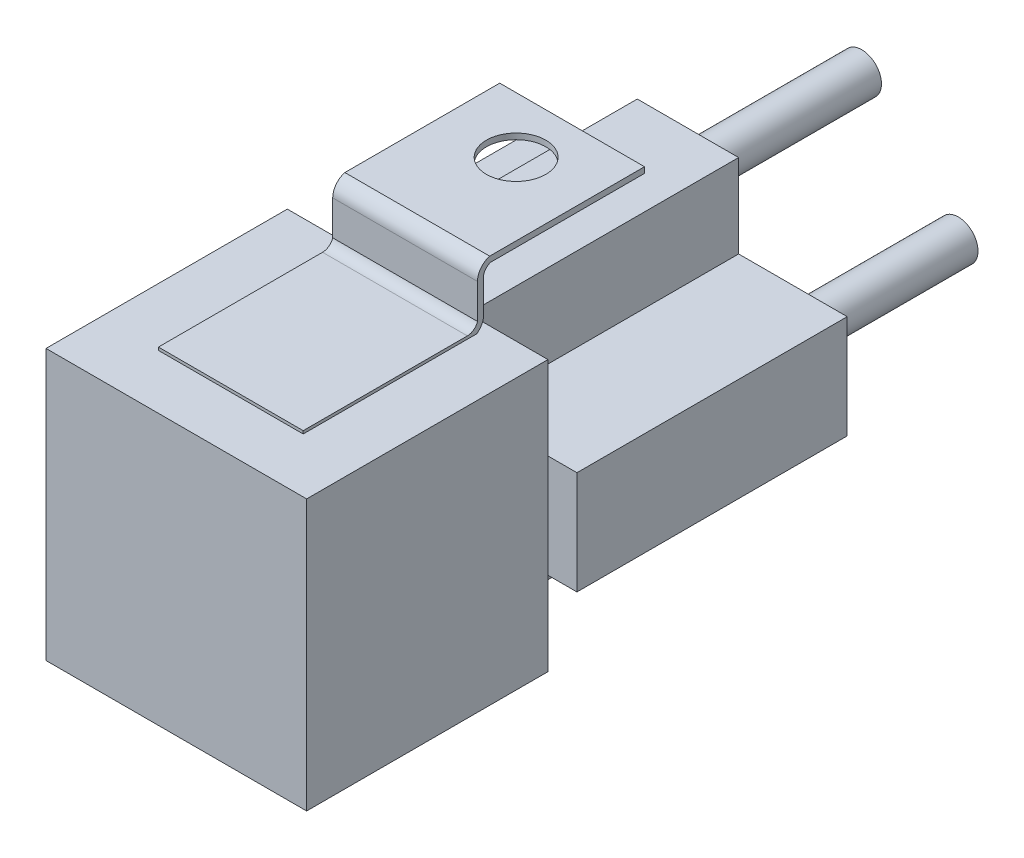
ISO-10303-21;
HEADER;
FILE_DESCRIPTION(('STEP AP214'),'2;1');
FILE_NAME('part.step','',(''),(''),'','','');
FILE_SCHEMA(('AUTOMOTIVE_DESIGN { 1 0 10303 214 1 1 1 1 }'));
ENDSEC;
DATA;
#1=APPLICATION_CONTEXT('core data for automotive mechanical design processes');
#2=APPLICATION_PROTOCOL_DEFINITION('international standard','automotive_design',2000,#1);
#3=PRODUCT_CONTEXT('',#1,'mechanical');
#4=PRODUCT('Part','Part','',(#3));
#5=PRODUCT_RELATED_PRODUCT_CATEGORY('part','',(#4));
#6=PRODUCT_DEFINITION_FORMATION('','',#4);
#7=PRODUCT_DEFINITION_CONTEXT('part definition',#1,'design');
#8=PRODUCT_DEFINITION('design','',#6,#7);
#9=PRODUCT_DEFINITION_SHAPE('','',#8);
#10=(LENGTH_UNIT() NAMED_UNIT(*) SI_UNIT(.MILLI.,.METRE.));
#11=(NAMED_UNIT(*) PLANE_ANGLE_UNIT() SI_UNIT($,.RADIAN.));
#12=(NAMED_UNIT(*) SI_UNIT($,.STERADIAN.) SOLID_ANGLE_UNIT());
#13=UNCERTAINTY_MEASURE_WITH_UNIT(LENGTH_MEASURE(1.E-05),#10,'distance_accuracy_value','');
#14=(GEOMETRIC_REPRESENTATION_CONTEXT(3) GLOBAL_UNCERTAINTY_ASSIGNED_CONTEXT((#13)) GLOBAL_UNIT_ASSIGNED_CONTEXT((#10,
#11,#12)) REPRESENTATION_CONTEXT('',''));
#15=CARTESIAN_POINT('',(0.,0.,0.));
#16=DIRECTION('',(0.,0.,1.));
#17=DIRECTION('',(1.,0.,0.));
#18=AXIS2_PLACEMENT_3D('',#15,#16,#17);
#19=CARTESIAN_POINT('',(0.,0.,-28.));
#20=DIRECTION('',(0.,0.,-1.));
#21=DIRECTION('',(-1.,0.,0.));
#22=AXIS2_PLACEMENT_3D('',#19,#20,#21);
#23=PLANE('',#22);
#24=CARTESIAN_POINT('',(-10.,0.,-28.));
#25=DIRECTION('',(0.,0.,-1.));
#26=DIRECTION('',(-1.,0.,0.));
#27=AXIS2_PLACEMENT_3D('',#24,#25,#26);
#28=CIRCLE('',#27,2.05);
#29=CARTESIAN_POINT('',(-12.05,0.,-28.));
#30=VERTEX_POINT('',#29);
#31=EDGE_CURVE('E362',#30,#30,#28,.T.);
#32=ORIENTED_EDGE('',*,*,#31,.F.);
#33=EDGE_LOOP('',(#32));
#34=FACE_BOUND('',#33,.T.);
#35=CARTESIAN_POINT('',(0.,10.,-28.));
#36=DIRECTION('',(0.,0.,-1.));
#37=DIRECTION('',(-1.,0.,0.));
#38=AXIS2_PLACEMENT_3D('',#35,#36,#37);
#39=CIRCLE('',#38,2.05);
#40=CARTESIAN_POINT('',(-2.05,10.,-28.));
#41=VERTEX_POINT('',#40);
#42=EDGE_CURVE('E373',#41,#41,#39,.T.);
#43=ORIENTED_EDGE('',*,*,#42,.F.);
#44=EDGE_LOOP('',(#43));
#45=FACE_BOUND('',#44,.T.);
#46=CARTESIAN_POINT('',(0.,-10.,-28.));
#47=DIRECTION('',(0.,0.,-1.));
#48=DIRECTION('',(-1.,0.,0.));
#49=AXIS2_PLACEMENT_3D('',#46,#47,#48);
#50=CIRCLE('',#49,2.05);
#51=CARTESIAN_POINT('',(-2.05,-10.,-28.));
#52=VERTEX_POINT('',#51);
#53=EDGE_CURVE('E377',#52,#52,#50,.T.);
#54=ORIENTED_EDGE('',*,*,#53,.F.);
#55=EDGE_LOOP('',(#54));
#56=FACE_BOUND('',#55,.T.);
#57=DIRECTION('',(1.,0.,0.));
#58=VECTOR('',#57,1.);
#59=CARTESIAN_POINT('',(-16.5,-5.35,-28.));
#60=LINE('',#59,#58);
#61=CARTESIAN_POINT('',(5.25,-5.35,-28.));
#62=VERTEX_POINT('',#61);
#63=CARTESIAN_POINT('',(16.5,-5.35,-28.));
#64=VERTEX_POINT('',#63);
#65=EDGE_CURVE('E393',#62,#64,#60,.T.);
#66=ORIENTED_EDGE('',*,*,#65,.F.);
#67=DIRECTION('',(0.,1.,0.));
#68=VECTOR('',#67,1.);
#69=CARTESIAN_POINT('',(5.25,-14.,-28.));
#70=LINE('',#69,#68);
#71=CARTESIAN_POINT('',(5.25,-14.,-28.));
#72=VERTEX_POINT('',#71);
#73=EDGE_CURVE('E435',#72,#62,#70,.T.);
#74=ORIENTED_EDGE('',*,*,#73,.F.);
#75=DIRECTION('',(1.,0.,0.));
#76=VECTOR('',#75,1.);
#77=CARTESIAN_POINT('',(-5.25,-14.,-28.));
#78=LINE('',#77,#76);
#79=CARTESIAN_POINT('',(-5.25,-14.,-28.));
#80=VERTEX_POINT('',#79);
#81=EDGE_CURVE('E430',#80,#72,#78,.T.);
#82=ORIENTED_EDGE('',*,*,#81,.F.);
#83=DIRECTION('',(0.,1.,0.));
#84=VECTOR('',#83,1.);
#85=CARTESIAN_POINT('',(-5.25,-14.,-28.));
#86=LINE('',#85,#84);
#87=CARTESIAN_POINT('',(-5.25,-5.35,-28.));
#88=VERTEX_POINT('',#87);
#89=EDGE_CURVE('E438',#80,#88,#86,.T.);
#90=ORIENTED_EDGE('',*,*,#89,.T.);
#91=CARTESIAN_POINT('',(-16.5,-5.35,-28.));
#92=VERTEX_POINT('',#91);
#93=EDGE_CURVE('E399',#92,#88,#60,.T.);
#94=ORIENTED_EDGE('',*,*,#93,.F.);
#95=DIRECTION('',(0.,1.,0.));
#96=VECTOR('',#95,1.);
#97=CARTESIAN_POINT('',(-16.5,-5.35,-28.));
#98=LINE('',#97,#96);
#99=CARTESIAN_POINT('',(-16.5,5.35,-28.));
#100=VERTEX_POINT('',#99);
#101=EDGE_CURVE('E383',#92,#100,#98,.T.);
#102=ORIENTED_EDGE('',*,*,#101,.T.);
#103=DIRECTION('',(1.,0.,0.));
#104=VECTOR('',#103,1.);
#105=CARTESIAN_POINT('',(-16.5,5.35,-28.));
#106=LINE('',#105,#104);
#107=CARTESIAN_POINT('',(-5.25,5.35,-28.));
#108=VERTEX_POINT('',#107);
#109=EDGE_CURVE('E386',#100,#108,#106,.T.);
#110=ORIENTED_EDGE('',*,*,#109,.T.);
#111=CARTESIAN_POINT('',(-5.25,14.,-28.));
#112=VERTEX_POINT('',#111);
#113=EDGE_CURVE('E437',#108,#112,#86,.T.);
#114=ORIENTED_EDGE('',*,*,#113,.T.);
#115=DIRECTION('',(1.,0.,0.));
#116=VECTOR('',#115,1.);
#117=CARTESIAN_POINT('',(-5.25,14.,-28.));
#118=LINE('',#117,#116);
#119=CARTESIAN_POINT('',(5.25,14.,-28.));
#120=VERTEX_POINT('',#119);
#121=EDGE_CURVE('E434',#112,#120,#118,.T.);
#122=ORIENTED_EDGE('',*,*,#121,.T.);
#123=CARTESIAN_POINT('',(5.25,5.35,-28.));
#124=VERTEX_POINT('',#123);
#125=EDGE_CURVE('E429',#124,#120,#70,.T.);
#126=ORIENTED_EDGE('',*,*,#125,.F.);
#127=CARTESIAN_POINT('',(16.5,5.35,-28.));
#128=VERTEX_POINT('',#127);
#129=EDGE_CURVE('E390',#124,#128,#106,.T.);
#130=ORIENTED_EDGE('',*,*,#129,.T.);
#131=DIRECTION('',(0.,1.,0.));
#132=VECTOR('',#131,1.);
#133=CARTESIAN_POINT('',(16.5,-5.35,-28.));
#134=LINE('',#133,#132);
#135=EDGE_CURVE('E394',#64,#128,#134,.T.);
#136=ORIENTED_EDGE('',*,*,#135,.F.);
#137=EDGE_LOOP('',(#66,#74,#82,#90,#94,#102,#110,#114,#122,#126,#130,#136));
#138=FACE_BOUND('',#137,.T.);
#139=CARTESIAN_POINT('',(10.,0.,-28.));
#140=DIRECTION('',(0.,0.,-1.));
#141=DIRECTION('',(-1.,0.,0.));
#142=AXIS2_PLACEMENT_3D('',#139,#140,#141);
#143=CIRCLE('',#142,2.05);
#144=CARTESIAN_POINT('',(7.95,0.,-28.));
#145=VERTEX_POINT('',#144);
#146=EDGE_CURVE('E361',#145,#145,#143,.T.);
#147=ORIENTED_EDGE('',*,*,#146,.F.);
#148=EDGE_LOOP('',(#147));
#149=FACE_BOUND('',#148,.T.);
#150=ADVANCED_FACE('F68',(#34,#45,#56,#138,#149),#23,.T.);
#151=CARTESIAN_POINT('',(0.,0.,0.));
#152=DIRECTION('',(0.,0.,1.));
#153=DIRECTION('',(1.,0.,0.));
#154=AXIS2_PLACEMENT_3D('',#151,#152,#153);
#155=PLANE('',#154);
#156=DIRECTION('',(1.,0.,0.));
#157=VECTOR('',#156,1.);
#158=CARTESIAN_POINT('',(-16.5,5.35,0.));
#159=LINE('',#158,#157);
#160=CARTESIAN_POINT('',(5.25,5.35,0.));
#161=VERTEX_POINT('',#160);
#162=CARTESIAN_POINT('',(13.5,5.35,0.));
#163=VERTEX_POINT('',#162);
#164=EDGE_CURVE('E406',#161,#163,#159,.T.);
#165=ORIENTED_EDGE('',*,*,#164,.F.);
#166=DIRECTION('',(0.,1.,0.));
#167=VECTOR('',#166,1.);
#168=CARTESIAN_POINT('',(5.25,-14.,0.));
#169=LINE('',#168,#167);
#170=CARTESIAN_POINT('',(5.25,14.,0.));
#171=VERTEX_POINT('',#170);
#172=EDGE_CURVE('E363',#161,#171,#169,.T.);
#173=ORIENTED_EDGE('',*,*,#172,.T.);
#174=DIRECTION('',(-1.,0.,0.));
#175=VECTOR('',#174,1.);
#176=CARTESIAN_POINT('',(-13.5,14.,0.));
#177=LINE('',#176,#175);
#178=CARTESIAN_POINT('',(13.5,14.,0.));
#179=VERTEX_POINT('',#178);
#180=EDGE_CURVE('E481',#179,#171,#177,.T.);
#181=ORIENTED_EDGE('',*,*,#180,.F.);
#182=DIRECTION('',(0.,1.,0.));
#183=VECTOR('',#182,1.);
#184=CARTESIAN_POINT('',(13.5,14.,0.));
#185=LINE('',#184,#183);
#186=EDGE_CURVE('E461',#163,#179,#185,.T.);
#187=ORIENTED_EDGE('',*,*,#186,.F.);
#188=EDGE_LOOP('',(#165,#173,#181,#187));
#189=FACE_BOUND('',#188,.T.);
#190=ADVANCED_FACE('F556',(#189),#155,.F.);
#191=DIRECTION('',(0.,1.,0.));
#192=VECTOR('',#191,1.);
#193=CARTESIAN_POINT('',(-5.25,-14.,0.));
#194=LINE('',#193,#192);
#195=CARTESIAN_POINT('',(-5.25,5.35,0.));
#196=VERTEX_POINT('',#195);
#197=CARTESIAN_POINT('',(-5.25,14.,0.));
#198=VERTEX_POINT('',#197);
#199=EDGE_CURVE('E447',#196,#198,#194,.T.);
#200=ORIENTED_EDGE('',*,*,#199,.F.);
#201=CARTESIAN_POINT('',(-13.5,5.35,0.));
#202=VERTEX_POINT('',#201);
#203=EDGE_CURVE('E370',#202,#196,#159,.T.);
#204=ORIENTED_EDGE('',*,*,#203,.F.);
#205=DIRECTION('',(0.,-1.,0.));
#206=VECTOR('',#205,1.);
#207=CARTESIAN_POINT('',(-13.5,14.,0.));
#208=LINE('',#207,#206);
#209=CARTESIAN_POINT('',(-13.5,14.,0.));
#210=VERTEX_POINT('',#209);
#211=EDGE_CURVE('E484',#210,#202,#208,.T.);
#212=ORIENTED_EDGE('',*,*,#211,.F.);
#213=EDGE_CURVE('E479',#198,#210,#177,.T.);
#214=ORIENTED_EDGE('',*,*,#213,.F.);
#215=EDGE_LOOP('',(#200,#204,#212,#214));
#216=FACE_BOUND('',#215,.T.);
#217=ADVANCED_FACE('F570',(#216),#155,.F.);
#218=CARTESIAN_POINT('',(-13.5,-5.35,0.));
#219=VERTEX_POINT('',#218);
#220=CARTESIAN_POINT('',(-13.5,-14.,0.));
#221=VERTEX_POINT('',#220);
#222=EDGE_CURVE('E482',#219,#221,#208,.T.);
#223=ORIENTED_EDGE('',*,*,#222,.F.);
#224=DIRECTION('',(1.,0.,0.));
#225=VECTOR('',#224,1.);
#226=CARTESIAN_POINT('',(-16.5,-5.35,0.));
#227=LINE('',#226,#225);
#228=CARTESIAN_POINT('',(-5.25,-5.35,0.));
#229=VERTEX_POINT('',#228);
#230=EDGE_CURVE('E505',#219,#229,#227,.T.);
#231=ORIENTED_EDGE('',*,*,#230,.T.);
#232=CARTESIAN_POINT('',(-5.25,-14.,0.));
#233=VERTEX_POINT('',#232);
#234=EDGE_CURVE('E431',#233,#229,#194,.T.);
#235=ORIENTED_EDGE('',*,*,#234,.F.);
#236=DIRECTION('',(1.,0.,0.));
#237=VECTOR('',#236,1.);
#238=CARTESIAN_POINT('',(-13.5,-14.,0.));
#239=LINE('',#238,#237);
#240=EDGE_CURVE('E468',#221,#233,#239,.T.);
#241=ORIENTED_EDGE('',*,*,#240,.F.);
#242=EDGE_LOOP('',(#223,#231,#235,#241));
#243=FACE_BOUND('',#242,.T.);
#244=ADVANCED_FACE('F616',(#243),#155,.F.);
#245=CARTESIAN_POINT('',(13.5,14.,25.));
#246=DIRECTION('',(-1.,0.,0.));
#247=DIRECTION('',(0.,-1.,0.));
#248=AXIS2_PLACEMENT_3D('',#245,#246,#247);
#249=PLANE('',#248);
#250=CARTESIAN_POINT('',(13.5,-14.,0.));
#251=VERTEX_POINT('',#250);
#252=CARTESIAN_POINT('',(13.5,-5.35,0.));
#253=VERTEX_POINT('',#252);
#254=EDGE_CURVE('E478',#251,#253,#185,.T.);
#255=ORIENTED_EDGE('',*,*,#254,.T.);
#256=EDGE_CURVE('E477',#253,#163,#185,.T.);
#257=ORIENTED_EDGE('',*,*,#256,.T.);
#258=ORIENTED_EDGE('',*,*,#186,.T.);
#259=DIRECTION('',(0.,0.,-1.));
#260=VECTOR('',#259,1.);
#261=CARTESIAN_POINT('',(13.5,14.,25.));
#262=LINE('',#261,#260);
#263=CARTESIAN_POINT('',(13.5,14.,25.));
#264=VERTEX_POINT('',#263);
#265=EDGE_CURVE('E498',#264,#179,#262,.T.);
#266=ORIENTED_EDGE('',*,*,#265,.F.);
#267=DIRECTION('',(0.,1.,0.));
#268=VECTOR('',#267,1.);
#269=CARTESIAN_POINT('',(13.5,14.,25.));
#270=LINE('',#269,#268);
#271=CARTESIAN_POINT('',(13.5,-14.,25.));
#272=VERTEX_POINT('',#271);
#273=EDGE_CURVE('E463',#272,#264,#270,.T.);
#274=ORIENTED_EDGE('',*,*,#273,.F.);
#275=DIRECTION('',(0.,0.,-1.));
#276=VECTOR('',#275,1.);
#277=CARTESIAN_POINT('',(13.5,-14.,25.));
#278=LINE('',#277,#276);
#279=EDGE_CURVE('E474',#272,#251,#278,.T.);
#280=ORIENTED_EDGE('',*,*,#279,.T.);
#281=EDGE_LOOP('',(#255,#257,#258,#266,#274,#280));
#282=FACE_BOUND('',#281,.T.);
#283=ADVANCED_FACE('F72',(#282),#249,.F.);
#284=CARTESIAN_POINT('',(-13.5,14.,25.));
#285=DIRECTION('',(0.,-1.,0.));
#286=DIRECTION('',(0.,0.,-1.));
#287=AXIS2_PLACEMENT_3D('',#284,#285,#286);
#288=PLANE('',#287);
#289=DIRECTION('',(-1.,0.,0.));
#290=VECTOR('',#289,1.);
#291=CARTESIAN_POINT('',(7.5,14.,1.38477109468164));
#292=LINE('',#291,#290);
#293=CARTESIAN_POINT('',(7.5,14.,1.38477109468164));
#294=VERTEX_POINT('',#293);
#295=CARTESIAN_POINT('',(-7.5,14.,1.38477109468164));
#296=VERTEX_POINT('',#295);
#297=EDGE_CURVE('E87',#294,#296,#292,.T.);
#298=ORIENTED_EDGE('',*,*,#297,.F.);
#299=DIRECTION('',(0.,0.,1.));
#300=VECTOR('',#299,1.);
#301=CARTESIAN_POINT('',(7.5,14.,25.));
#302=LINE('',#301,#300);
#303=CARTESIAN_POINT('',(7.5,14.,19.3565132389192));
#304=VERTEX_POINT('',#303);
#305=EDGE_CURVE('E12',#294,#304,#302,.T.);
#306=ORIENTED_EDGE('',*,*,#305,.T.);
#307=DIRECTION('',(-1.,0.,0.));
#308=VECTOR('',#307,1.);
#309=CARTESIAN_POINT('',(-13.5,14.,19.3565132389192));
#310=LINE('',#309,#308);
#311=CARTESIAN_POINT('',(-7.5,14.,19.3565132389192));
#312=VERTEX_POINT('',#311);
#313=EDGE_CURVE('E79',#304,#312,#310,.T.);
#314=ORIENTED_EDGE('',*,*,#313,.T.);
#315=DIRECTION('',(0.,0.,1.));
#316=VECTOR('',#315,1.);
#317=CARTESIAN_POINT('',(-7.5,14.,25.));
#318=LINE('',#317,#316);
#319=EDGE_CURVE('E368',#296,#312,#318,.T.);
#320=ORIENTED_EDGE('',*,*,#319,.F.);
#321=EDGE_LOOP('',(#298,#306,#314,#320));
#322=FACE_BOUND('',#321,.T.);
#323=ORIENTED_EDGE('',*,*,#180,.T.);
#324=DIRECTION('',(0.,0.,1.));
#325=VECTOR('',#324,1.);
#326=CARTESIAN_POINT('',(5.25,14.,-28.));
#327=LINE('',#326,#325);
#328=EDGE_CURVE('E455',#120,#171,#327,.T.);
#329=ORIENTED_EDGE('',*,*,#328,.F.);
#330=ORIENTED_EDGE('',*,*,#121,.F.);
#331=DIRECTION('',(0.,0.,1.));
#332=VECTOR('',#331,1.);
#333=CARTESIAN_POINT('',(-5.25,14.,-28.));
#334=LINE('',#333,#332);
#335=EDGE_CURVE('E448',#112,#198,#334,.T.);
#336=ORIENTED_EDGE('',*,*,#335,.T.);
#337=ORIENTED_EDGE('',*,*,#213,.T.);
#338=DIRECTION('',(0.,0.,-1.));
#339=VECTOR('',#338,1.);
#340=CARTESIAN_POINT('',(-13.5,14.,25.));
#341=LINE('',#340,#339);
#342=CARTESIAN_POINT('',(-13.5,14.,25.));
#343=VERTEX_POINT('',#342);
#344=EDGE_CURVE('E500',#343,#210,#341,.T.);
#345=ORIENTED_EDGE('',*,*,#344,.F.);
#346=DIRECTION('',(-1.,0.,0.));
#347=VECTOR('',#346,1.);
#348=CARTESIAN_POINT('',(-13.5,14.,25.));
#349=LINE('',#348,#347);
#350=EDGE_CURVE('E470',#264,#343,#349,.T.);
#351=ORIENTED_EDGE('',*,*,#350,.F.);
#352=ORIENTED_EDGE('',*,*,#265,.T.);
#353=EDGE_LOOP('',(#323,#329,#330,#336,#337,#345,#351,#352));
#354=FACE_BOUND('',#353,.T.);
#355=ADVANCED_FACE('F509',(#322,#354),#288,.F.);
#356=CARTESIAN_POINT('',(-13.5,14.,25.));
#357=DIRECTION('',(1.,0.,0.));
#358=DIRECTION('',(0.,1.,0.));
#359=AXIS2_PLACEMENT_3D('',#356,#357,#358);
#360=PLANE('',#359);
#361=ORIENTED_EDGE('',*,*,#211,.T.);
#362=EDGE_CURVE('E487',#202,#219,#208,.T.);
#363=ORIENTED_EDGE('',*,*,#362,.T.);
#364=ORIENTED_EDGE('',*,*,#222,.T.);
#365=DIRECTION('',(0.,0.,-1.));
#366=VECTOR('',#365,1.);
#367=CARTESIAN_POINT('',(-13.5,-14.,25.));
#368=LINE('',#367,#366);
#369=CARTESIAN_POINT('',(-13.5,-14.,25.));
#370=VERTEX_POINT('',#369);
#371=EDGE_CURVE('E493',#370,#221,#368,.T.);
#372=ORIENTED_EDGE('',*,*,#371,.F.);
#373=DIRECTION('',(0.,-1.,0.));
#374=VECTOR('',#373,1.);
#375=CARTESIAN_POINT('',(-13.5,14.,25.));
#376=LINE('',#375,#374);
#377=EDGE_CURVE('E473',#343,#370,#376,.T.);
#378=ORIENTED_EDGE('',*,*,#377,.F.);
#379=ORIENTED_EDGE('',*,*,#344,.T.);
#380=EDGE_LOOP('',(#361,#363,#364,#372,#378,#379));
#381=FACE_BOUND('',#380,.T.);
#382=ADVANCED_FACE('F617',(#381),#360,.F.);
#383=CARTESIAN_POINT('',(-13.5,-14.,25.));
#384=DIRECTION('',(0.,1.,0.));
#385=DIRECTION('',(0.,0.,1.));
#386=AXIS2_PLACEMENT_3D('',#383,#384,#385);
#387=PLANE('',#386);
#388=ORIENTED_EDGE('',*,*,#240,.T.);
#389=DIRECTION('',(0.,0.,1.));
#390=VECTOR('',#389,1.);
#391=CARTESIAN_POINT('',(-5.25,-14.,-28.));
#392=LINE('',#391,#390);
#393=EDGE_CURVE('E404',#80,#233,#392,.T.);
#394=ORIENTED_EDGE('',*,*,#393,.F.);
#395=ORIENTED_EDGE('',*,*,#81,.T.);
#396=DIRECTION('',(0.,0.,1.));
#397=VECTOR('',#396,1.);
#398=CARTESIAN_POINT('',(5.25,-14.,-28.));
#399=LINE('',#398,#397);
#400=CARTESIAN_POINT('',(5.25,-14.,0.));
#401=VERTEX_POINT('',#400);
#402=EDGE_CURVE('E445',#72,#401,#399,.T.);
#403=ORIENTED_EDGE('',*,*,#402,.T.);
#404=EDGE_CURVE('E488',#401,#251,#239,.T.);
#405=ORIENTED_EDGE('',*,*,#404,.T.);
#406=ORIENTED_EDGE('',*,*,#279,.F.);
#407=DIRECTION('',(1.,0.,0.));
#408=VECTOR('',#407,1.);
#409=CARTESIAN_POINT('',(-13.5,-14.,25.));
#410=LINE('',#409,#408);
#411=EDGE_CURVE('E471',#370,#272,#410,.T.);
#412=ORIENTED_EDGE('',*,*,#411,.F.);
#413=ORIENTED_EDGE('',*,*,#371,.T.);
#414=EDGE_LOOP('',(#388,#394,#395,#403,#405,#406,#412,#413));
#415=FACE_BOUND('',#414,.T.);
#416=ADVANCED_FACE('F614',(#415),#387,.F.);
#417=CARTESIAN_POINT('',(0.,0.,25.));
#418=DIRECTION('',(0.,0.,1.));
#419=DIRECTION('',(1.,0.,0.));
#420=AXIS2_PLACEMENT_3D('',#417,#418,#419);
#421=PLANE('',#420);
#422=ORIENTED_EDGE('',*,*,#273,.T.);
#423=ORIENTED_EDGE('',*,*,#350,.T.);
#424=ORIENTED_EDGE('',*,*,#377,.T.);
#425=ORIENTED_EDGE('',*,*,#411,.T.);
#426=EDGE_LOOP('',(#422,#423,#424,#425));
#427=FACE_BOUND('',#426,.T.);
#428=ADVANCED_FACE('F608',(#427),#421,.T.);
#429=ORIENTED_EDGE('',*,*,#404,.F.);
#430=CARTESIAN_POINT('',(5.25,-5.35,0.));
#431=VERTEX_POINT('',#430);
#432=EDGE_CURVE('E444',#401,#431,#169,.T.);
#433=ORIENTED_EDGE('',*,*,#432,.T.);
#434=EDGE_CURVE('E412',#431,#253,#227,.T.);
#435=ORIENTED_EDGE('',*,*,#434,.T.);
#436=ORIENTED_EDGE('',*,*,#254,.F.);
#437=EDGE_LOOP('',(#429,#433,#435,#436));
#438=FACE_BOUND('',#437,.T.);
#439=ADVANCED_FACE('F568',(#438),#155,.F.);
#440=CARTESIAN_POINT('',(0.,0.,0.));
#441=DIRECTION('',(0.,0.,-1.));
#442=DIRECTION('',(-1.,0.,0.));
#443=AXIS2_PLACEMENT_3D('',#440,#441,#442);
#444=PLANE('',#443);
#445=ORIENTED_EDGE('',*,*,#256,.F.);
#446=CARTESIAN_POINT('',(16.5,-5.35,0.));
#447=VERTEX_POINT('',#446);
#448=EDGE_CURVE('E411',#253,#447,#227,.T.);
#449=ORIENTED_EDGE('',*,*,#448,.T.);
#450=DIRECTION('',(0.,1.,0.));
#451=VECTOR('',#450,1.);
#452=CARTESIAN_POINT('',(16.5,-5.35,0.));
#453=LINE('',#452,#451);
#454=CARTESIAN_POINT('',(16.5,5.35,0.));
#455=VERTEX_POINT('',#454);
#456=EDGE_CURVE('E410',#447,#455,#453,.T.);
#457=ORIENTED_EDGE('',*,*,#456,.T.);
#458=EDGE_CURVE('E401',#163,#455,#159,.T.);
#459=ORIENTED_EDGE('',*,*,#458,.F.);
#460=EDGE_LOOP('',(#445,#449,#457,#459));
#461=FACE_BOUND('',#460,.T.);
#462=ADVANCED_FACE('F581',(#461),#444,.F.);
#463=CARTESIAN_POINT('',(16.5,-5.35,-28.));
#464=DIRECTION('',(1.,0.,0.));
#465=DIRECTION('',(0.,0.,-1.));
#466=AXIS2_PLACEMENT_3D('',#463,#464,#465);
#467=PLANE('',#466);
#468=ORIENTED_EDGE('',*,*,#456,.F.);
#469=DIRECTION('',(0.,0.,1.));
#470=VECTOR('',#469,1.);
#471=CARTESIAN_POINT('',(16.5,-5.35,-28.));
#472=LINE('',#471,#470);
#473=EDGE_CURVE('E417',#64,#447,#472,.T.);
#474=ORIENTED_EDGE('',*,*,#473,.F.);
#475=ORIENTED_EDGE('',*,*,#135,.T.);
#476=DIRECTION('',(0.,0.,1.));
#477=VECTOR('',#476,1.);
#478=CARTESIAN_POINT('',(16.5,5.35,-28.));
#479=LINE('',#478,#477);
#480=EDGE_CURVE('E419',#128,#455,#479,.T.);
#481=ORIENTED_EDGE('',*,*,#480,.T.);
#482=EDGE_LOOP('',(#468,#474,#475,#481));
#483=FACE_BOUND('',#482,.T.);
#484=ADVANCED_FACE('F590',(#483),#467,.T.);
#485=CARTESIAN_POINT('',(-16.5,-5.35,-28.));
#486=DIRECTION('',(0.,-1.,0.));
#487=DIRECTION('',(0.,0.,-1.));
#488=AXIS2_PLACEMENT_3D('',#485,#486,#487);
#489=PLANE('',#488);
#490=DIRECTION('',(0.,0.,1.));
#491=VECTOR('',#490,1.);
#492=CARTESIAN_POINT('',(5.25,-5.35,-28.));
#493=LINE('',#492,#491);
#494=EDGE_CURVE('E426',#62,#431,#493,.T.);
#495=ORIENTED_EDGE('',*,*,#494,.F.);
#496=ORIENTED_EDGE('',*,*,#65,.T.);
#497=ORIENTED_EDGE('',*,*,#473,.T.);
#498=ORIENTED_EDGE('',*,*,#448,.F.);
#499=ORIENTED_EDGE('',*,*,#434,.F.);
#500=EDGE_LOOP('',(#495,#496,#497,#498,#499));
#501=FACE_BOUND('',#500,.T.);
#502=ADVANCED_FACE('F585',(#501),#489,.T.);
#503=CARTESIAN_POINT('',(-16.5,5.35,-28.));
#504=DIRECTION('',(0.,-1.,0.));
#505=DIRECTION('',(0.,0.,-1.));
#506=AXIS2_PLACEMENT_3D('',#503,#504,#505);
#507=PLANE('',#506);
#508=ORIENTED_EDGE('',*,*,#129,.F.);
#509=DIRECTION('',(0.,0.,1.));
#510=VECTOR('',#509,1.);
#511=CARTESIAN_POINT('',(5.25,5.35,-28.));
#512=LINE('',#511,#510);
#513=EDGE_CURVE('E456',#124,#161,#512,.T.);
#514=ORIENTED_EDGE('',*,*,#513,.T.);
#515=ORIENTED_EDGE('',*,*,#164,.T.);
#516=ORIENTED_EDGE('',*,*,#458,.T.);
#517=ORIENTED_EDGE('',*,*,#480,.F.);
#518=EDGE_LOOP('',(#508,#514,#515,#516,#517));
#519=FACE_BOUND('',#518,.T.);
#520=ADVANCED_FACE('F583',(#519),#507,.F.);
#521=ORIENTED_EDGE('',*,*,#362,.F.);
#522=CARTESIAN_POINT('',(-16.5,5.35,0.));
#523=VERTEX_POINT('',#522);
#524=EDGE_CURVE('E403',#523,#202,#159,.T.);
#525=ORIENTED_EDGE('',*,*,#524,.F.);
#526=DIRECTION('',(0.,1.,0.));
#527=VECTOR('',#526,1.);
#528=CARTESIAN_POINT('',(-16.5,-5.35,0.));
#529=LINE('',#528,#527);
#530=CARTESIAN_POINT('',(-16.5,-5.35,0.));
#531=VERTEX_POINT('',#530);
#532=EDGE_CURVE('E397',#531,#523,#529,.T.);
#533=ORIENTED_EDGE('',*,*,#532,.F.);
#534=EDGE_CURVE('E389',#531,#219,#227,.T.);
#535=ORIENTED_EDGE('',*,*,#534,.T.);
#536=EDGE_LOOP('',(#521,#525,#533,#535));
#537=FACE_BOUND('',#536,.T.);
#538=ADVANCED_FACE('F576',(#537),#444,.F.);
#539=ORIENTED_EDGE('',*,*,#93,.T.);
#540=DIRECTION('',(0.,0.,1.));
#541=VECTOR('',#540,1.);
#542=CARTESIAN_POINT('',(-5.25,-5.35,-28.));
#543=LINE('',#542,#541);
#544=EDGE_CURVE('E460',#88,#229,#543,.T.);
#545=ORIENTED_EDGE('',*,*,#544,.T.);
#546=ORIENTED_EDGE('',*,*,#230,.F.);
#547=ORIENTED_EDGE('',*,*,#534,.F.);
#548=DIRECTION('',(0.,0.,1.));
#549=VECTOR('',#548,1.);
#550=CARTESIAN_POINT('',(-16.5,-5.35,-28.));
#551=LINE('',#550,#549);
#552=EDGE_CURVE('E398',#92,#531,#551,.T.);
#553=ORIENTED_EDGE('',*,*,#552,.F.);
#554=EDGE_LOOP('',(#539,#545,#546,#547,#553));
#555=FACE_BOUND('',#554,.T.);
#556=ADVANCED_FACE('F577',(#555),#489,.T.);
#557=CARTESIAN_POINT('',(-16.5,-5.35,-28.));
#558=DIRECTION('',(1.,0.,0.));
#559=DIRECTION('',(0.,0.,-1.));
#560=AXIS2_PLACEMENT_3D('',#557,#558,#559);
#561=PLANE('',#560);
#562=ORIENTED_EDGE('',*,*,#532,.T.);
#563=DIRECTION('',(0.,0.,1.));
#564=VECTOR('',#563,1.);
#565=CARTESIAN_POINT('',(-16.5,5.35,-28.));
#566=LINE('',#565,#564);
#567=EDGE_CURVE('E421',#100,#523,#566,.T.);
#568=ORIENTED_EDGE('',*,*,#567,.F.);
#569=ORIENTED_EDGE('',*,*,#101,.F.);
#570=ORIENTED_EDGE('',*,*,#552,.T.);
#571=EDGE_LOOP('',(#562,#568,#569,#570));
#572=FACE_BOUND('',#571,.T.);
#573=ADVANCED_FACE('F596',(#572),#561,.F.);
#574=DIRECTION('',(0.,0.,1.));
#575=VECTOR('',#574,1.);
#576=CARTESIAN_POINT('',(-5.25,5.35,-28.));
#577=LINE('',#576,#575);
#578=EDGE_CURVE('E458',#108,#196,#577,.T.);
#579=ORIENTED_EDGE('',*,*,#578,.F.);
#580=ORIENTED_EDGE('',*,*,#109,.F.);
#581=ORIENTED_EDGE('',*,*,#567,.T.);
#582=ORIENTED_EDGE('',*,*,#524,.T.);
#583=ORIENTED_EDGE('',*,*,#203,.T.);
#584=EDGE_LOOP('',(#579,#580,#581,#582,#583));
#585=FACE_BOUND('',#584,.T.);
#586=ADVANCED_FACE('F594',(#585),#507,.F.);
#587=CARTESIAN_POINT('',(-5.25,-14.,-28.));
#588=DIRECTION('',(1.,0.,0.));
#589=DIRECTION('',(0.,0.,-1.));
#590=AXIS2_PLACEMENT_3D('',#587,#588,#589);
#591=PLANE('',#590);
#592=ORIENTED_EDGE('',*,*,#544,.F.);
#593=ORIENTED_EDGE('',*,*,#89,.F.);
#594=ORIENTED_EDGE('',*,*,#393,.T.);
#595=ORIENTED_EDGE('',*,*,#234,.T.);
#596=EDGE_LOOP('',(#592,#593,#594,#595));
#597=FACE_BOUND('',#596,.T.);
#598=ADVANCED_FACE('F599',(#597),#591,.F.);
#599=CARTESIAN_POINT('',(5.25,-14.,-28.));
#600=DIRECTION('',(1.,0.,0.));
#601=DIRECTION('',(0.,0.,-1.));
#602=AXIS2_PLACEMENT_3D('',#599,#600,#601);
#603=PLANE('',#602);
#604=ORIENTED_EDGE('',*,*,#73,.T.);
#605=ORIENTED_EDGE('',*,*,#494,.T.);
#606=ORIENTED_EDGE('',*,*,#432,.F.);
#607=ORIENTED_EDGE('',*,*,#402,.F.);
#608=EDGE_LOOP('',(#604,#605,#606,#607));
#609=FACE_BOUND('',#608,.T.);
#610=ADVANCED_FACE('F602',(#609),#603,.T.);
#611=ORIENTED_EDGE('',*,*,#113,.F.);
#612=ORIENTED_EDGE('',*,*,#578,.T.);
#613=ORIENTED_EDGE('',*,*,#199,.T.);
#614=ORIENTED_EDGE('',*,*,#335,.F.);
#615=EDGE_LOOP('',(#611,#612,#613,#614));
#616=FACE_BOUND('',#615,.T.);
#617=ADVANCED_FACE('F604',(#616),#591,.F.);
#618=ORIENTED_EDGE('',*,*,#513,.F.);
#619=ORIENTED_EDGE('',*,*,#125,.T.);
#620=ORIENTED_EDGE('',*,*,#328,.T.);
#621=ORIENTED_EDGE('',*,*,#172,.F.);
#622=EDGE_LOOP('',(#618,#619,#620,#621));
#623=FACE_BOUND('',#622,.T.);
#624=ADVANCED_FACE('F606',(#623),#603,.T.);
#625=CARTESIAN_POINT('',(0.,-10.,-46.));
#626=DIRECTION('',(0.,0.,1.));
#627=DIRECTION('',(1.,0.,0.));
#628=AXIS2_PLACEMENT_3D('',#625,#626,#627);
#629=CYLINDRICAL_SURFACE('',#628,2.05);
#630=CARTESIAN_POINT('',(0.,-10.,-46.));
#631=DIRECTION('',(0.,0.,-1.));
#632=DIRECTION('',(-1.,0.,0.));
#633=AXIS2_PLACEMENT_3D('',#630,#631,#632);
#634=CIRCLE('',#633,2.05);
#635=CARTESIAN_POINT('',(-2.05,-10.,-46.));
#636=VERTEX_POINT('',#635);
#637=EDGE_CURVE('E281',#636,#636,#634,.T.);
#638=ORIENTED_EDGE('',*,*,#637,.F.);
#639=EDGE_LOOP('',(#638));
#640=FACE_BOUND('',#639,.T.);
#641=ORIENTED_EDGE('',*,*,#53,.T.);
#642=EDGE_LOOP('',(#641));
#643=FACE_BOUND('',#642,.T.);
#644=ADVANCED_FACE('F822',(#640,#643),#629,.T.);
#645=CARTESIAN_POINT('',(0.,-10.,-46.));
#646=DIRECTION('',(0.,0.,-1.));
#647=DIRECTION('',(-1.,0.,0.));
#648=AXIS2_PLACEMENT_3D('',#645,#646,#647);
#649=PLANE('',#648);
#650=ORIENTED_EDGE('',*,*,#637,.T.);
#651=EDGE_LOOP('',(#650));
#652=FACE_BOUND('',#651,.T.);
#653=ADVANCED_FACE('F573',(#652),#649,.T.);
#654=CARTESIAN_POINT('',(0.,10.,-46.));
#655=DIRECTION('',(0.,0.,1.));
#656=DIRECTION('',(1.,0.,0.));
#657=AXIS2_PLACEMENT_3D('',#654,#655,#656);
#658=CYLINDRICAL_SURFACE('',#657,2.05);
#659=CARTESIAN_POINT('',(0.,10.,-46.));
#660=DIRECTION('',(0.,0.,-1.));
#661=DIRECTION('',(-1.,0.,0.));
#662=AXIS2_PLACEMENT_3D('',#659,#660,#661);
#663=CIRCLE('',#662,2.05);
#664=CARTESIAN_POINT('',(-2.05,10.,-46.));
#665=VERTEX_POINT('',#664);
#666=EDGE_CURVE('E376',#665,#665,#663,.T.);
#667=ORIENTED_EDGE('',*,*,#666,.F.);
#668=EDGE_LOOP('',(#667));
#669=FACE_BOUND('',#668,.T.);
#670=ORIENTED_EDGE('',*,*,#42,.T.);
#671=EDGE_LOOP('',(#670));
#672=FACE_BOUND('',#671,.T.);
#673=ADVANCED_FACE('F850',(#669,#672),#658,.T.);
#674=CARTESIAN_POINT('',(0.,10.,-46.));
#675=DIRECTION('',(0.,0.,-1.));
#676=DIRECTION('',(-1.,0.,0.));
#677=AXIS2_PLACEMENT_3D('',#674,#675,#676);
#678=PLANE('',#677);
#679=ORIENTED_EDGE('',*,*,#666,.T.);
#680=EDGE_LOOP('',(#679));
#681=FACE_BOUND('',#680,.T.);
#682=ADVANCED_FACE('F860',(#681),#678,.T.);
#683=CARTESIAN_POINT('',(-10.,0.,-46.));
#684=DIRECTION('',(0.,0.,1.));
#685=DIRECTION('',(1.,0.,0.));
#686=AXIS2_PLACEMENT_3D('',#683,#684,#685);
#687=CYLINDRICAL_SURFACE('',#686,2.05);
#688=CARTESIAN_POINT('',(-10.,0.,-46.));
#689=DIRECTION('',(0.,0.,-1.));
#690=DIRECTION('',(-1.,0.,0.));
#691=AXIS2_PLACEMENT_3D('',#688,#689,#690);
#692=CIRCLE('',#691,2.05);
#693=CARTESIAN_POINT('',(-12.05,0.,-46.));
#694=VERTEX_POINT('',#693);
#695=EDGE_CURVE('E367',#694,#694,#692,.T.);
#696=ORIENTED_EDGE('',*,*,#695,.F.);
#697=EDGE_LOOP('',(#696));
#698=FACE_BOUND('',#697,.T.);
#699=ORIENTED_EDGE('',*,*,#31,.T.);
#700=EDGE_LOOP('',(#699));
#701=FACE_BOUND('',#700,.T.);
#702=ADVANCED_FACE('F871',(#698,#701),#687,.T.);
#703=CARTESIAN_POINT('',(-10.,0.,-46.));
#704=DIRECTION('',(0.,0.,-1.));
#705=DIRECTION('',(-1.,0.,0.));
#706=AXIS2_PLACEMENT_3D('',#703,#704,#705);
#707=PLANE('',#706);
#708=ORIENTED_EDGE('',*,*,#695,.T.);
#709=EDGE_LOOP('',(#708));
#710=FACE_BOUND('',#709,.T.);
#711=ADVANCED_FACE('F884',(#710),#707,.T.);
#712=CARTESIAN_POINT('',(10.,0.,-46.));
#713=DIRECTION('',(0.,0.,1.));
#714=DIRECTION('',(1.,0.,0.));
#715=AXIS2_PLACEMENT_3D('',#712,#713,#714);
#716=CYLINDRICAL_SURFACE('',#715,2.05);
#717=CARTESIAN_POINT('',(10.,0.,-46.));
#718=DIRECTION('',(0.,0.,-1.));
#719=DIRECTION('',(-1.,0.,0.));
#720=AXIS2_PLACEMENT_3D('',#717,#718,#719);
#721=CIRCLE('',#720,2.05);
#722=CARTESIAN_POINT('',(7.95,0.,-46.));
#723=VERTEX_POINT('',#722);
#724=EDGE_CURVE('E360',#723,#723,#721,.T.);
#725=ORIENTED_EDGE('',*,*,#724,.F.);
#726=EDGE_LOOP('',(#725));
#727=FACE_BOUND('',#726,.T.);
#728=ORIENTED_EDGE('',*,*,#146,.T.);
#729=EDGE_LOOP('',(#728));
#730=FACE_BOUND('',#729,.T.);
#731=ADVANCED_FACE('F892',(#727,#730),#716,.T.);
#732=CARTESIAN_POINT('',(10.,0.,-46.));
#733=DIRECTION('',(0.,0.,-1.));
#734=DIRECTION('',(-1.,0.,0.));
#735=AXIS2_PLACEMENT_3D('',#732,#733,#734);
#736=PLANE('',#735);
#737=ORIENTED_EDGE('',*,*,#724,.T.);
#738=EDGE_LOOP('',(#737));
#739=FACE_BOUND('',#738,.T.);
#740=ADVANCED_FACE('F909',(#739),#736,.T.);
#741=CARTESIAN_POINT('',(7.5,13.7,19.3565132389192));
#742=DIRECTION('',(0.,0.,1.));
#743=DIRECTION('',(1.,0.,0.));
#744=AXIS2_PLACEMENT_3D('',#741,#742,#743);
#745=PLANE('',#744);
#746=ORIENTED_EDGE('',*,*,#313,.F.);
#747=DIRECTION('',(0.,1.,0.));
#748=VECTOR('',#747,1.);
#749=CARTESIAN_POINT('',(7.5,13.7,19.3565132389192));
#750=LINE('',#749,#748);
#751=CARTESIAN_POINT('',(7.5,14.3,19.3565132389192));
#752=VERTEX_POINT('',#751);
#753=EDGE_CURVE('E302',#304,#752,#750,.T.);
#754=ORIENTED_EDGE('',*,*,#753,.T.);
#755=DIRECTION('',(-1.,0.,0.));
#756=VECTOR('',#755,1.);
#757=CARTESIAN_POINT('',(7.5,14.3,19.3565132389192));
#758=LINE('',#757,#756);
#759=CARTESIAN_POINT('',(-7.5,14.3,19.3565132389192));
#760=VERTEX_POINT('',#759);
#761=EDGE_CURVE('E347',#752,#760,#758,.T.);
#762=ORIENTED_EDGE('',*,*,#761,.T.);
#763=DIRECTION('',(0.,1.,0.));
#764=VECTOR('',#763,1.);
#765=CARTESIAN_POINT('',(-7.5,13.7,19.3565132389192));
#766=LINE('',#765,#764);
#767=EDGE_CURVE('E335',#312,#760,#766,.T.);
#768=ORIENTED_EDGE('',*,*,#767,.F.);
#769=EDGE_LOOP('',(#746,#754,#762,#768));
#770=FACE_BOUND('',#769,.T.);
#771=ADVANCED_FACE('F513',(#770),#745,.T.);
#772=CARTESIAN_POINT('',(7.5,15.4,2.34913617078094));
#773=DIRECTION('',(-1.,0.,0.));
#774=DIRECTION('',(0.,0.,1.));
#775=AXIS2_PLACEMENT_3D('',#772,#773,#774);
#776=CYLINDRICAL_SURFACE('',#775,1.7);
#777=CARTESIAN_POINT('',(7.5,15.4,2.34913617078094));
#778=DIRECTION('',(1.,0.,0.));
#779=DIRECTION('',(0.,0.,-1.));
#780=AXIS2_PLACEMENT_3D('',#777,#778,#779);
#781=CIRCLE('',#780,1.7);
#782=CARTESIAN_POINT('',(7.5,14.9872653513188,0.7));
#783=VERTEX_POINT('',#782);
#784=EDGE_CURVE('E307',#294,#783,#781,.T.);
#785=ORIENTED_EDGE('',*,*,#784,.F.);
#786=ORIENTED_EDGE('',*,*,#297,.T.);
#787=CARTESIAN_POINT('',(-7.5,15.4,2.34913617078094));
#788=DIRECTION('',(1.,0.,0.));
#789=DIRECTION('',(0.,0.,-1.));
#790=AXIS2_PLACEMENT_3D('',#787,#788,#789);
#791=CIRCLE('',#790,1.7);
#792=CARTESIAN_POINT('',(-7.5,14.9872653513188,0.7));
#793=VERTEX_POINT('',#792);
#794=EDGE_CURVE('E331',#296,#793,#791,.T.);
#795=ORIENTED_EDGE('',*,*,#794,.T.);
#796=DIRECTION('',(-1.,0.,0.));
#797=VECTOR('',#796,1.);
#798=CARTESIAN_POINT('',(7.5,14.9872653513188,0.7));
#799=LINE('',#798,#797);
#800=EDGE_CURVE('E345',#783,#793,#799,.T.);
#801=ORIENTED_EDGE('',*,*,#800,.F.);
#802=EDGE_LOOP('',(#785,#786,#795,#801));
#803=FACE_BOUND('',#802,.T.);
#804=ADVANCED_FACE('F537',(#803),#776,.T.);
#805=CARTESIAN_POINT('',(7.5,18.6583592135001,-0.4));
#806=DIRECTION('',(1.,0.,0.));
#807=DIRECTION('',(0.,0.,-1.));
#808=AXIS2_PLACEMENT_3D('',#805,#806,#807);
#809=PLANE('',#808);
#810=ORIENTED_EDGE('',*,*,#305,.F.);
#811=ORIENTED_EDGE('',*,*,#784,.T.);
#812=DIRECTION('',(0.,1.,0.));
#813=VECTOR('',#812,1.);
#814=CARTESIAN_POINT('',(7.5,15.0260593727735,0.7));
#815=LINE('',#814,#813);
#816=CARTESIAN_POINT('',(7.5,18.6583592135001,0.7));
#817=VERTEX_POINT('',#816);
#818=EDGE_CURVE('E310',#783,#817,#815,.T.);
#819=ORIENTED_EDGE('',*,*,#818,.T.);
#820=CARTESIAN_POINT('',(7.5,18.6583592135001,-0.4));
#821=DIRECTION('',(1.,0.,0.));
#822=DIRECTION('',(0.,0.,-1.));
#823=AXIS2_PLACEMENT_3D('',#820,#821,#822);
#824=CIRCLE('',#823,1.1);
#825=CARTESIAN_POINT('',(7.5,19.7,-0.046468570138484));
#826=VERTEX_POINT('',#825);
#827=EDGE_CURVE('E269',#817,#826,#824,.F.);
#828=ORIENTED_EDGE('',*,*,#827,.T.);
#829=DIRECTION('',(0.,0.,-1.));
#830=VECTOR('',#829,1.);
#831=CARTESIAN_POINT('',(7.5,19.7,0.));
#832=LINE('',#831,#830);
#833=CARTESIAN_POINT('',(7.5,19.7,-16.));
#834=VERTEX_POINT('',#833);
#835=EDGE_CURVE('E265',#826,#834,#832,.T.);
#836=ORIENTED_EDGE('',*,*,#835,.T.);
#837=DIRECTION('',(0.,-1.,0.));
#838=VECTOR('',#837,1.);
#839=CARTESIAN_POINT('',(7.5,20.3,-16.));
#840=LINE('',#839,#838);
#841=CARTESIAN_POINT('',(7.5,20.3,-16.));
#842=VERTEX_POINT('',#841);
#843=EDGE_CURVE('E270',#842,#834,#840,.T.);
#844=ORIENTED_EDGE('',*,*,#843,.F.);
#845=DIRECTION('',(0.,0.,-1.));
#846=VECTOR('',#845,1.);
#847=CARTESIAN_POINT('',(7.5,20.3,0.));
#848=LINE('',#847,#846);
#849=CARTESIAN_POINT('',(7.5,20.3,0.0416056250774784));
#850=VERTEX_POINT('',#849);
#851=EDGE_CURVE('E290',#850,#842,#848,.T.);
#852=ORIENTED_EDGE('',*,*,#851,.F.);
#853=CARTESIAN_POINT('',(7.5,18.6583592135001,-0.4));
#854=DIRECTION('',(1.,0.,0.));
#855=DIRECTION('',(0.,0.,-1.));
#856=AXIS2_PLACEMENT_3D('',#853,#854,#855);
#857=CIRCLE('',#856,1.7);
#858=CARTESIAN_POINT('',(7.5,18.6583592135001,1.3));
#859=VERTEX_POINT('',#858);
#860=EDGE_CURVE('E287',#859,#850,#857,.F.);
#861=ORIENTED_EDGE('',*,*,#860,.F.);
#862=DIRECTION('',(0.,1.,0.));
#863=VECTOR('',#862,1.);
#864=CARTESIAN_POINT('',(7.5,15.0260593727735,1.3));
#865=LINE('',#864,#863);
#866=CARTESIAN_POINT('',(7.5,15.0693743882288,1.3));
#867=VERTEX_POINT('',#866);
#868=EDGE_CURVE('E297',#867,#859,#865,.T.);
#869=ORIENTED_EDGE('',*,*,#868,.F.);
#870=CARTESIAN_POINT('',(7.5,15.4,2.34913617078094));
#871=DIRECTION('',(1.,0.,0.));
#872=DIRECTION('',(0.,0.,-1.));
#873=AXIS2_PLACEMENT_3D('',#870,#871,#872);
#874=CIRCLE('',#873,1.1);
#875=CARTESIAN_POINT('',(7.5,14.3,2.34913617078094));
#876=VERTEX_POINT('',#875);
#877=EDGE_CURVE('E296',#876,#867,#874,.T.);
#878=ORIENTED_EDGE('',*,*,#877,.F.);
#879=DIRECTION('',(0.,0.,-1.));
#880=VECTOR('',#879,1.);
#881=CARTESIAN_POINT('',(7.5,14.3,19.3565132389192));
#882=LINE('',#881,#880);
#883=EDGE_CURVE('E301',#752,#876,#882,.T.);
#884=ORIENTED_EDGE('',*,*,#883,.F.);
#885=ORIENTED_EDGE('',*,*,#753,.F.);
#886=EDGE_LOOP('',(#810,#811,#819,#828,#836,#844,#852,#861,#869,#878,#884,#885));
#887=FACE_BOUND('',#886,.T.);
#888=ADVANCED_FACE('F262',(#887),#809,.T.);
#889=CARTESIAN_POINT('',(-7.5,18.6583592135001,-0.4));
#890=DIRECTION('',(1.,0.,0.));
#891=DIRECTION('',(0.,0.,-1.));
#892=AXIS2_PLACEMENT_3D('',#889,#890,#891);
#893=PLANE('',#892);
#894=ORIENTED_EDGE('',*,*,#794,.F.);
#895=ORIENTED_EDGE('',*,*,#319,.T.);
#896=ORIENTED_EDGE('',*,*,#767,.T.);
#897=DIRECTION('',(0.,0.,-1.));
#898=VECTOR('',#897,1.);
#899=CARTESIAN_POINT('',(-7.5,14.3,19.3565132389192));
#900=LINE('',#899,#898);
#901=CARTESIAN_POINT('',(-7.5,14.3,2.34913617078094));
#902=VERTEX_POINT('',#901);
#903=EDGE_CURVE('E328',#760,#902,#900,.T.);
#904=ORIENTED_EDGE('',*,*,#903,.T.);
#905=CARTESIAN_POINT('',(-7.5,15.4,2.34913617078094));
#906=DIRECTION('',(1.,0.,0.));
#907=DIRECTION('',(0.,0.,-1.));
#908=AXIS2_PLACEMENT_3D('',#905,#906,#907);
#909=CIRCLE('',#908,1.1);
#910=CARTESIAN_POINT('',(-7.5,15.0693743882288,1.3));
#911=VERTEX_POINT('',#910);
#912=EDGE_CURVE('E326',#902,#911,#909,.T.);
#913=ORIENTED_EDGE('',*,*,#912,.T.);
#914=DIRECTION('',(0.,1.,0.));
#915=VECTOR('',#914,1.);
#916=CARTESIAN_POINT('',(-7.5,15.0260593727735,1.3));
#917=LINE('',#916,#915);
#918=CARTESIAN_POINT('',(-7.5,18.6583592135001,1.3));
#919=VERTEX_POINT('',#918);
#920=EDGE_CURVE('E323',#911,#919,#917,.T.);
#921=ORIENTED_EDGE('',*,*,#920,.T.);
#922=CARTESIAN_POINT('',(-7.5,18.6583592135001,-0.4));
#923=DIRECTION('',(1.,0.,0.));
#924=DIRECTION('',(0.,0.,-1.));
#925=AXIS2_PLACEMENT_3D('',#922,#923,#924);
#926=CIRCLE('',#925,1.7);
#927=CARTESIAN_POINT('',(-7.5,20.3,0.0416056250774784));
#928=VERTEX_POINT('',#927);
#929=EDGE_CURVE('E319',#919,#928,#926,.F.);
#930=ORIENTED_EDGE('',*,*,#929,.T.);
#931=DIRECTION('',(0.,0.,-1.));
#932=VECTOR('',#931,1.);
#933=CARTESIAN_POINT('',(-7.5,20.3,0.));
#934=LINE('',#933,#932);
#935=CARTESIAN_POINT('',(-7.5,20.3,-16.));
#936=VERTEX_POINT('',#935);
#937=EDGE_CURVE('E320',#928,#936,#934,.T.);
#938=ORIENTED_EDGE('',*,*,#937,.T.);
#939=DIRECTION('',(0.,-1.,0.));
#940=VECTOR('',#939,1.);
#941=CARTESIAN_POINT('',(-7.5,20.3,-16.));
#942=LINE('',#941,#940);
#943=CARTESIAN_POINT('',(-7.5,19.7,-16.));
#944=VERTEX_POINT('',#943);
#945=EDGE_CURVE('E314',#936,#944,#942,.T.);
#946=ORIENTED_EDGE('',*,*,#945,.T.);
#947=DIRECTION('',(0.,0.,-1.));
#948=VECTOR('',#947,1.);
#949=CARTESIAN_POINT('',(-7.5,19.7,0.));
#950=LINE('',#949,#948);
#951=CARTESIAN_POINT('',(-7.5,19.7,-0.046468570138484));
#952=VERTEX_POINT('',#951);
#953=EDGE_CURVE('E278',#952,#944,#950,.T.);
#954=ORIENTED_EDGE('',*,*,#953,.F.);
#955=CARTESIAN_POINT('',(-7.5,18.6583592135001,-0.4));
#956=DIRECTION('',(1.,0.,0.));
#957=DIRECTION('',(0.,0.,-1.));
#958=AXIS2_PLACEMENT_3D('',#955,#956,#957);
#959=CIRCLE('',#958,1.1);
#960=CARTESIAN_POINT('',(-7.5,18.6583592135001,0.7));
#961=VERTEX_POINT('',#960);
#962=EDGE_CURVE('E273',#961,#952,#959,.F.);
#963=ORIENTED_EDGE('',*,*,#962,.F.);
#964=DIRECTION('',(0.,1.,0.));
#965=VECTOR('',#964,1.);
#966=CARTESIAN_POINT('',(-7.5,15.0260593727735,0.7));
#967=LINE('',#966,#965);
#968=EDGE_CURVE('E337',#793,#961,#967,.T.);
#969=ORIENTED_EDGE('',*,*,#968,.F.);
#970=EDGE_LOOP('',(#894,#895,#896,#904,#913,#921,#930,#938,#946,#954,#963,#969));
#971=FACE_BOUND('',#970,.T.);
#972=ADVANCED_FACE('F511',(#971),#893,.F.);
#973=CARTESIAN_POINT('',(7.5,19.7,0.));
#974=DIRECTION('',(0.,1.,0.));
#975=DIRECTION('',(0.,0.,1.));
#976=AXIS2_PLACEMENT_3D('',#973,#974,#975);
#977=PLANE('',#976);
#978=CARTESIAN_POINT('',(0.,19.7,-10.2));
#979=DIRECTION('',(0.,1.,0.));
#980=DIRECTION('',(0.,0.,1.));
#981=AXIS2_PLACEMENT_3D('',#978,#979,#980);
#982=CIRCLE('',#981,3.075);
#983=CARTESIAN_POINT('',(0.,19.7,-7.125));
#984=VERTEX_POINT('',#983);
#985=EDGE_CURVE('E1101',#984,#984,#982,.F.);
#986=ORIENTED_EDGE('',*,*,#985,.F.);
#987=EDGE_LOOP('',(#986));
#988=FACE_BOUND('',#987,.T.);
#989=ORIENTED_EDGE('',*,*,#953,.T.);
#990=DIRECTION('',(-1.,0.,0.));
#991=VECTOR('',#990,1.);
#992=CARTESIAN_POINT('',(7.5,19.7,-16.));
#993=LINE('',#992,#991);
#994=EDGE_CURVE('E280',#834,#944,#993,.T.);
#995=ORIENTED_EDGE('',*,*,#994,.F.);
#996=ORIENTED_EDGE('',*,*,#835,.F.);
#997=DIRECTION('',(-1.,0.,0.));
#998=VECTOR('',#997,1.);
#999=CARTESIAN_POINT('',(7.5,19.7,-0.046468570138484));
#1000=LINE('',#999,#998);
#1001=EDGE_CURVE('E315',#826,#952,#1000,.T.);
#1002=ORIENTED_EDGE('',*,*,#1001,.T.);
#1003=EDGE_LOOP('',(#989,#995,#996,#1002));
#1004=FACE_BOUND('',#1003,.T.);
#1005=ADVANCED_FACE('F279',(#988,#1004),#977,.F.);
#1006=CARTESIAN_POINT('',(7.5,20.3,-16.));
#1007=DIRECTION('',(0.,0.,-1.));
#1008=DIRECTION('',(-1.,0.,0.));
#1009=AXIS2_PLACEMENT_3D('',#1006,#1007,#1008);
#1010=PLANE('',#1009);
#1011=ORIENTED_EDGE('',*,*,#945,.F.);
#1012=DIRECTION('',(-1.,0.,0.));
#1013=VECTOR('',#1012,1.);
#1014=CARTESIAN_POINT('',(7.5,20.3,-16.));
#1015=LINE('',#1014,#1013);
#1016=EDGE_CURVE('E283',#842,#936,#1015,.T.);
#1017=ORIENTED_EDGE('',*,*,#1016,.F.);
#1018=ORIENTED_EDGE('',*,*,#843,.T.);
#1019=ORIENTED_EDGE('',*,*,#994,.T.);
#1020=EDGE_LOOP('',(#1011,#1017,#1018,#1019));
#1021=FACE_BOUND('',#1020,.T.);
#1022=ADVANCED_FACE('F286',(#1021),#1010,.T.);
#1023=CARTESIAN_POINT('',(7.5,20.3,0.));
#1024=DIRECTION('',(0.,1.,0.));
#1025=DIRECTION('',(0.,0.,1.));
#1026=AXIS2_PLACEMENT_3D('',#1023,#1024,#1025);
#1027=PLANE('',#1026);
#1028=CARTESIAN_POINT('',(0.,20.3,-10.2));
#1029=DIRECTION('',(0.,1.,0.));
#1030=DIRECTION('',(0.,0.,1.));
#1031=AXIS2_PLACEMENT_3D('',#1028,#1029,#1030);
#1032=CIRCLE('',#1031,3.075);
#1033=CARTESIAN_POINT('',(0.,20.3,-7.125));
#1034=VERTEX_POINT('',#1033);
#1035=EDGE_CURVE('E312',#1034,#1034,#1032,.T.);
#1036=ORIENTED_EDGE('',*,*,#1035,.F.);
#1037=EDGE_LOOP('',(#1036));
#1038=FACE_BOUND('',#1037,.T.);
#1039=ORIENTED_EDGE('',*,*,#937,.F.);
#1040=DIRECTION('',(-1.,0.,0.));
#1041=VECTOR('',#1040,1.);
#1042=CARTESIAN_POINT('',(7.5,20.3,0.0416056250774784));
#1043=LINE('',#1042,#1041);
#1044=EDGE_CURVE('E353',#850,#928,#1043,.T.);
#1045=ORIENTED_EDGE('',*,*,#1044,.F.);
#1046=ORIENTED_EDGE('',*,*,#851,.T.);
#1047=ORIENTED_EDGE('',*,*,#1016,.T.);
#1048=EDGE_LOOP('',(#1039,#1045,#1046,#1047));
#1049=FACE_BOUND('',#1048,.T.);
#1050=ADVANCED_FACE('F532',(#1038,#1049),#1027,.T.);
#1051=CARTESIAN_POINT('',(7.5,18.6583592135001,-0.4));
#1052=DIRECTION('',(-1.,0.,0.));
#1053=DIRECTION('',(0.,0.,1.));
#1054=AXIS2_PLACEMENT_3D('',#1051,#1052,#1053);
#1055=CYLINDRICAL_SURFACE('',#1054,1.7);
#1056=ORIENTED_EDGE('',*,*,#929,.F.);
#1057=DIRECTION('',(-1.,0.,0.));
#1058=VECTOR('',#1057,1.);
#1059=CARTESIAN_POINT('',(7.5,18.6583592135001,1.3));
#1060=LINE('',#1059,#1058);
#1061=EDGE_CURVE('E355',#859,#919,#1060,.T.);
#1062=ORIENTED_EDGE('',*,*,#1061,.F.);
#1063=ORIENTED_EDGE('',*,*,#860,.T.);
#1064=ORIENTED_EDGE('',*,*,#1044,.T.);
#1065=EDGE_LOOP('',(#1056,#1062,#1063,#1064));
#1066=FACE_BOUND('',#1065,.T.);
#1067=ADVANCED_FACE('F535',(#1066),#1055,.T.);
#1068=CARTESIAN_POINT('',(7.5,15.0260593727735,1.3));
#1069=DIRECTION('',(0.,0.,1.));
#1070=DIRECTION('',(1.,0.,0.));
#1071=AXIS2_PLACEMENT_3D('',#1068,#1069,#1070);
#1072=PLANE('',#1071);
#1073=ORIENTED_EDGE('',*,*,#920,.F.);
#1074=DIRECTION('',(-1.,0.,0.));
#1075=VECTOR('',#1074,1.);
#1076=CARTESIAN_POINT('',(7.5,15.0693743882288,1.3));
#1077=LINE('',#1076,#1075);
#1078=EDGE_CURVE('E352',#867,#911,#1077,.T.);
#1079=ORIENTED_EDGE('',*,*,#1078,.F.);
#1080=ORIENTED_EDGE('',*,*,#868,.T.);
#1081=ORIENTED_EDGE('',*,*,#1061,.T.);
#1082=EDGE_LOOP('',(#1073,#1079,#1080,#1081));
#1083=FACE_BOUND('',#1082,.T.);
#1084=ADVANCED_FACE('F526',(#1083),#1072,.T.);
#1085=CARTESIAN_POINT('',(7.5,15.4,2.34913617078094));
#1086=DIRECTION('',(-1.,0.,0.));
#1087=DIRECTION('',(0.,0.,1.));
#1088=AXIS2_PLACEMENT_3D('',#1085,#1086,#1087);
#1089=CYLINDRICAL_SURFACE('',#1088,1.1);
#1090=ORIENTED_EDGE('',*,*,#912,.F.);
#1091=DIRECTION('',(-1.,0.,0.));
#1092=VECTOR('',#1091,1.);
#1093=CARTESIAN_POINT('',(7.5,14.3,2.34913617078094));
#1094=LINE('',#1093,#1092);
#1095=EDGE_CURVE('E349',#876,#902,#1094,.T.);
#1096=ORIENTED_EDGE('',*,*,#1095,.F.);
#1097=ORIENTED_EDGE('',*,*,#877,.T.);
#1098=ORIENTED_EDGE('',*,*,#1078,.T.);
#1099=EDGE_LOOP('',(#1090,#1096,#1097,#1098));
#1100=FACE_BOUND('',#1099,.T.);
#1101=ADVANCED_FACE('F523',(#1100),#1089,.F.);
#1102=CARTESIAN_POINT('',(7.5,14.3,19.3565132389192));
#1103=DIRECTION('',(0.,1.,0.));
#1104=DIRECTION('',(0.,0.,1.));
#1105=AXIS2_PLACEMENT_3D('',#1102,#1103,#1104);
#1106=PLANE('',#1105);
#1107=ORIENTED_EDGE('',*,*,#903,.F.);
#1108=ORIENTED_EDGE('',*,*,#761,.F.);
#1109=ORIENTED_EDGE('',*,*,#883,.T.);
#1110=ORIENTED_EDGE('',*,*,#1095,.T.);
#1111=EDGE_LOOP('',(#1107,#1108,#1109,#1110));
#1112=FACE_BOUND('',#1111,.T.);
#1113=ADVANCED_FACE('F518',(#1112),#1106,.T.);
#1114=CARTESIAN_POINT('',(7.5,15.0260593727735,0.7));
#1115=DIRECTION('',(0.,0.,1.));
#1116=DIRECTION('',(1.,0.,0.));
#1117=AXIS2_PLACEMENT_3D('',#1114,#1115,#1116);
#1118=PLANE('',#1117);
#1119=ORIENTED_EDGE('',*,*,#968,.T.);
#1120=DIRECTION('',(-1.,0.,0.));
#1121=VECTOR('',#1120,1.);
#1122=CARTESIAN_POINT('',(7.5,18.6583592135001,0.7));
#1123=LINE('',#1122,#1121);
#1124=EDGE_CURVE('E338',#817,#961,#1123,.T.);
#1125=ORIENTED_EDGE('',*,*,#1124,.F.);
#1126=ORIENTED_EDGE('',*,*,#818,.F.);
#1127=ORIENTED_EDGE('',*,*,#800,.T.);
#1128=EDGE_LOOP('',(#1119,#1125,#1126,#1127));
#1129=FACE_BOUND('',#1128,.T.);
#1130=ADVANCED_FACE('F543',(#1129),#1118,.F.);
#1131=CARTESIAN_POINT('',(7.5,18.6583592135001,-0.4));
#1132=DIRECTION('',(-1.,0.,0.));
#1133=DIRECTION('',(0.,0.,1.));
#1134=AXIS2_PLACEMENT_3D('',#1131,#1132,#1133);
#1135=CYLINDRICAL_SURFACE('',#1134,1.1);
#1136=ORIENTED_EDGE('',*,*,#962,.T.);
#1137=ORIENTED_EDGE('',*,*,#1001,.F.);
#1138=ORIENTED_EDGE('',*,*,#827,.F.);
#1139=ORIENTED_EDGE('',*,*,#1124,.T.);
#1140=EDGE_LOOP('',(#1136,#1137,#1138,#1139));
#1141=FACE_BOUND('',#1140,.T.);
#1142=ADVANCED_FACE('F546',(#1141),#1135,.F.);
#1143=CARTESIAN_POINT('',(0.,-14.001,-10.2));
#1144=DIRECTION('',(0.,1.,0.));
#1145=DIRECTION('',(0.,0.,1.));
#1146=AXIS2_PLACEMENT_3D('',#1143,#1144,#1145);
#1147=CYLINDRICAL_SURFACE('',#1146,3.075);
#1148=ORIENTED_EDGE('',*,*,#1035,.T.);
#1149=EDGE_LOOP('',(#1148));
#1150=FACE_BOUND('',#1149,.T.);
#1151=ORIENTED_EDGE('',*,*,#985,.T.);
#1152=EDGE_LOOP('',(#1151));
#1153=FACE_BOUND('',#1152,.T.);
#1154=ADVANCED_FACE('F547',(#1150,#1153),#1147,.F.);
#1155=CLOSED_SHELL('',(#150,#190,#217,#244,#283,#355,#382,#416,#428,#439,#462,#484,#502,#520,
#538,#556,#573,#586,#598,#610,#617,#624,#644,#653,#673,#682,#702,#711,#731,#740,#771,#804,#888,
#972,#1005,#1022,#1050,#1067,#1084,#1101,#1113,#1130,#1142,#1154));
#1156=MANIFOLD_SOLID_BREP('B2',#1155);
#1157=ADVANCED_BREP_SHAPE_REPRESENTATION('',(#18,#1156),#14);
#1158=SHAPE_DEFINITION_REPRESENTATION(#9,#1157);
ENDSEC;
END-ISO-10303-21;
